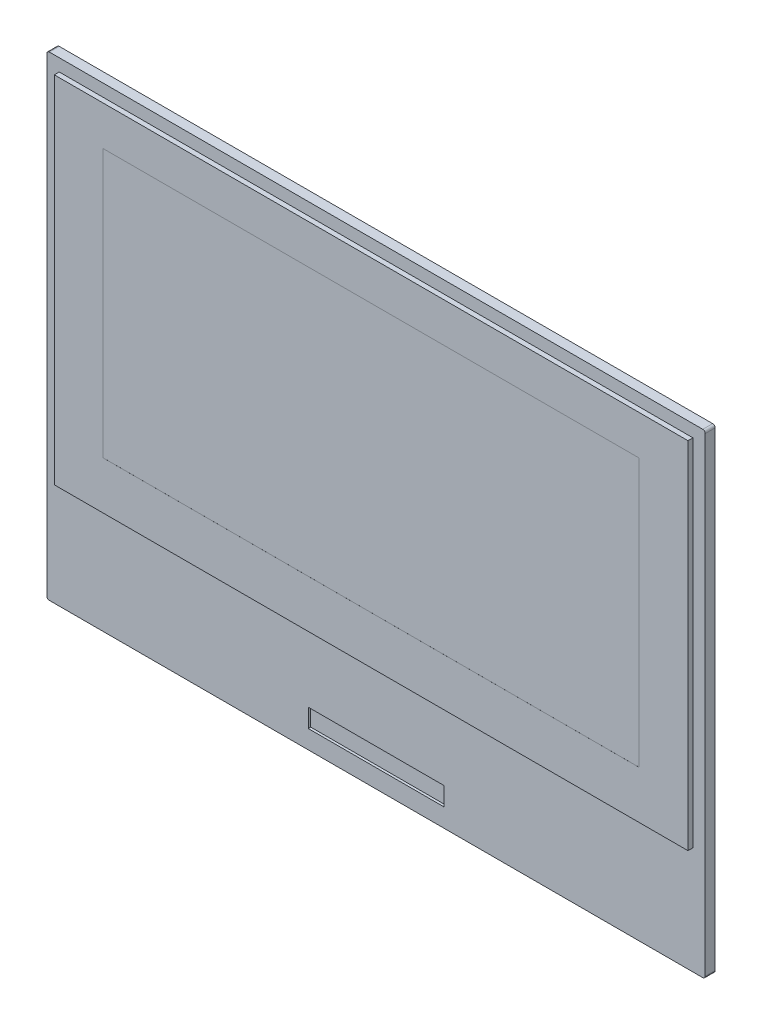
ISO-10303-21;
HEADER;
FILE_DESCRIPTION(('STEP AP214'),'2;1');
FILE_NAME('part.step','',(''),(''),'','','');
FILE_SCHEMA(('AUTOMOTIVE_DESIGN { 1 0 10303 214 1 1 1 1 }'));
ENDSEC;
DATA;
#1=APPLICATION_CONTEXT('core data for automotive mechanical design processes');
#2=APPLICATION_PROTOCOL_DEFINITION('international standard','automotive_design',2000,#1);
#3=PRODUCT_CONTEXT('',#1,'mechanical');
#4=PRODUCT('Part','Part','',(#3));
#5=PRODUCT_RELATED_PRODUCT_CATEGORY('part','',(#4));
#6=PRODUCT_DEFINITION_FORMATION('','',#4);
#7=PRODUCT_DEFINITION_CONTEXT('part definition',#1,'design');
#8=PRODUCT_DEFINITION('design','',#6,#7);
#9=PRODUCT_DEFINITION_SHAPE('','',#8);
#10=(LENGTH_UNIT() NAMED_UNIT(*) SI_UNIT(.MILLI.,.METRE.));
#11=(NAMED_UNIT(*) PLANE_ANGLE_UNIT() SI_UNIT($,.RADIAN.));
#12=(NAMED_UNIT(*) SI_UNIT($,.STERADIAN.) SOLID_ANGLE_UNIT());
#13=UNCERTAINTY_MEASURE_WITH_UNIT(LENGTH_MEASURE(1.E-05),#10,'distance_accuracy_value','');
#14=(GEOMETRIC_REPRESENTATION_CONTEXT(3) GLOBAL_UNCERTAINTY_ASSIGNED_CONTEXT((#13)) GLOBAL_UNIT_ASSIGNED_CONTEXT((#10,
#11,#12)) REPRESENTATION_CONTEXT('',''));
#15=CARTESIAN_POINT('',(0.,0.,0.));
#16=DIRECTION('',(0.,0.,1.));
#17=DIRECTION('',(1.,0.,0.));
#18=AXIS2_PLACEMENT_3D('',#15,#16,#17);
#19=CARTESIAN_POINT('',(0.,0.,0.));
#20=DIRECTION('',(0.,0.,1.));
#21=DIRECTION('',(1.,0.,0.));
#22=AXIS2_PLACEMENT_3D('',#19,#20,#21);
#23=PLANE('',#22);
#24=DIRECTION('',(0.,1.,0.));
#25=VECTOR('',#24,1.);
#26=CARTESIAN_POINT('',(2.75000000000001,-8.13,0.));
#27=LINE('',#26,#25);
#28=CARTESIAN_POINT('',(2.75000000000001,-8.88,0.));
#29=VERTEX_POINT('',#28);
#30=CARTESIAN_POINT('',(2.75000000000001,-8.13,0.));
#31=VERTEX_POINT('',#30);
#32=EDGE_CURVE('E57',#29,#31,#27,.T.);
#33=ORIENTED_EDGE('',*,*,#32,.F.);
#34=DIRECTION('',(1.,0.,0.));
#35=VECTOR('',#34,1.);
#36=CARTESIAN_POINT('',(-2.74999999999999,-8.88,0.));
#37=LINE('',#36,#35);
#38=CARTESIAN_POINT('',(-2.74999999999999,-8.88,0.));
#39=VERTEX_POINT('',#38);
#40=EDGE_CURVE('E237',#39,#29,#37,.T.);
#41=ORIENTED_EDGE('',*,*,#40,.F.);
#42=DIRECTION('',(0.,-1.,0.));
#43=VECTOR('',#42,1.);
#44=CARTESIAN_POINT('',(-2.74999999999999,-8.13,0.));
#45=LINE('',#44,#43);
#46=CARTESIAN_POINT('',(-2.74999999999999,-8.13,0.));
#47=VERTEX_POINT('',#46);
#48=EDGE_CURVE('E251',#47,#39,#45,.T.);
#49=ORIENTED_EDGE('',*,*,#48,.F.);
#50=DIRECTION('',(-1.,0.,0.));
#51=VECTOR('',#50,1.);
#52=CARTESIAN_POINT('',(-2.74999999999999,-8.13,0.));
#53=LINE('',#52,#51);
#54=EDGE_CURVE('E248',#31,#47,#53,.T.);
#55=ORIENTED_EDGE('',*,*,#54,.F.);
#56=EDGE_LOOP('',(#33,#41,#49,#55));
#57=FACE_BOUND('',#56,.T.);
#58=DIRECTION('',(1.,0.,0.));
#59=VECTOR('',#58,1.);
#60=CARTESIAN_POINT('',(-13.35,-9.63,0.));
#61=LINE('',#60,#59);
#62=CARTESIAN_POINT('',(-13.25,-9.63,0.));
#63=VERTEX_POINT('',#62);
#64=CARTESIAN_POINT('',(13.25,-9.63,0.));
#65=VERTEX_POINT('',#64);
#66=EDGE_CURVE('E329',#63,#65,#61,.T.);
#67=ORIENTED_EDGE('',*,*,#66,.T.);
#68=CARTESIAN_POINT('',(13.25,-9.53,0.));
#69=DIRECTION('',(0.,0.,1.));
#70=DIRECTION('',(1.,0.,0.));
#71=AXIS2_PLACEMENT_3D('',#68,#69,#70);
#72=CIRCLE('',#71,0.1);
#73=CARTESIAN_POINT('',(13.35,-9.53,0.));
#74=VERTEX_POINT('',#73);
#75=EDGE_CURVE('E359',#65,#74,#72,.T.);
#76=ORIENTED_EDGE('',*,*,#75,.T.);
#77=DIRECTION('',(0.,1.,0.));
#78=VECTOR('',#77,1.);
#79=CARTESIAN_POINT('',(13.35,9.63,0.));
#80=LINE('',#79,#78);
#81=CARTESIAN_POINT('',(13.35,9.53,0.));
#82=VERTEX_POINT('',#81);
#83=EDGE_CURVE('E324',#74,#82,#80,.T.);
#84=ORIENTED_EDGE('',*,*,#83,.T.);
#85=CARTESIAN_POINT('',(13.25,9.53,0.));
#86=DIRECTION('',(0.,0.,1.));
#87=DIRECTION('',(1.,0.,0.));
#88=AXIS2_PLACEMENT_3D('',#85,#86,#87);
#89=CIRCLE('',#88,0.1);
#90=CARTESIAN_POINT('',(13.25,9.63,0.));
#91=VERTEX_POINT('',#90);
#92=EDGE_CURVE('E353',#82,#91,#89,.T.);
#93=ORIENTED_EDGE('',*,*,#92,.T.);
#94=DIRECTION('',(-1.,0.,0.));
#95=VECTOR('',#94,1.);
#96=CARTESIAN_POINT('',(-13.35,9.63,0.));
#97=LINE('',#96,#95);
#98=CARTESIAN_POINT('',(-13.25,9.63,0.));
#99=VERTEX_POINT('',#98);
#100=EDGE_CURVE('E341',#91,#99,#97,.T.);
#101=ORIENTED_EDGE('',*,*,#100,.T.);
#102=CARTESIAN_POINT('',(-13.25,9.53,0.));
#103=DIRECTION('',(0.,0.,1.));
#104=DIRECTION('',(1.,0.,0.));
#105=AXIS2_PLACEMENT_3D('',#102,#103,#104);
#106=CIRCLE('',#105,0.1);
#107=CARTESIAN_POINT('',(-13.35,9.53,0.));
#108=VERTEX_POINT('',#107);
#109=EDGE_CURVE('E355',#99,#108,#106,.T.);
#110=ORIENTED_EDGE('',*,*,#109,.T.);
#111=DIRECTION('',(0.,-1.,0.));
#112=VECTOR('',#111,1.);
#113=CARTESIAN_POINT('',(-13.35,9.63,0.));
#114=LINE('',#113,#112);
#115=CARTESIAN_POINT('',(-13.35,-9.53,0.));
#116=VERTEX_POINT('',#115);
#117=EDGE_CURVE('E344',#108,#116,#114,.T.);
#118=ORIENTED_EDGE('',*,*,#117,.T.);
#119=CARTESIAN_POINT('',(-13.25,-9.53,0.));
#120=DIRECTION('',(0.,0.,1.));
#121=DIRECTION('',(1.,0.,0.));
#122=AXIS2_PLACEMENT_3D('',#119,#120,#121);
#123=CIRCLE('',#122,0.1);
#124=EDGE_CURVE('E357',#116,#63,#123,.T.);
#125=ORIENTED_EDGE('',*,*,#124,.T.);
#126=EDGE_LOOP('',(#67,#76,#84,#93,#101,#110,#118,#125));
#127=FACE_BOUND('',#126,.T.);
#128=DIRECTION('',(1.,0.,0.));
#129=VECTOR('',#128,1.);
#130=CARTESIAN_POINT('',(-12.85,-5.27,0.));
#131=LINE('',#130,#129);
#132=CARTESIAN_POINT('',(-12.85,-5.27,0.));
#133=VERTEX_POINT('',#132);
#134=CARTESIAN_POINT('',(12.85,-5.27,0.));
#135=VERTEX_POINT('',#134);
#136=EDGE_CURVE('E309',#133,#135,#131,.T.);
#137=ORIENTED_EDGE('',*,*,#136,.F.);
#138=DIRECTION('',(0.,-1.,0.));
#139=VECTOR('',#138,1.);
#140=CARTESIAN_POINT('',(-12.85,9.13,0.));
#141=LINE('',#140,#139);
#142=CARTESIAN_POINT('',(-12.85,9.13,0.));
#143=VERTEX_POINT('',#142);
#144=EDGE_CURVE('E289',#143,#133,#141,.T.);
#145=ORIENTED_EDGE('',*,*,#144,.F.);
#146=DIRECTION('',(-1.,0.,0.));
#147=VECTOR('',#146,1.);
#148=CARTESIAN_POINT('',(-12.85,9.13,0.));
#149=LINE('',#148,#147);
#150=CARTESIAN_POINT('',(12.85,9.13,0.));
#151=VERTEX_POINT('',#150);
#152=EDGE_CURVE('E300',#151,#143,#149,.T.);
#153=ORIENTED_EDGE('',*,*,#152,.F.);
#154=DIRECTION('',(0.,1.,0.));
#155=VECTOR('',#154,1.);
#156=CARTESIAN_POINT('',(12.85,9.13,0.));
#157=LINE('',#156,#155);
#158=EDGE_CURVE('E311',#135,#151,#157,.T.);
#159=ORIENTED_EDGE('',*,*,#158,.F.);
#160=EDGE_LOOP('',(#137,#145,#153,#159));
#161=FACE_BOUND('',#160,.T.);
#162=ADVANCED_FACE('F34',(#57,#127,#161),#23,.T.);
#163=CARTESIAN_POINT('',(13.35,9.63,-0.4));
#164=DIRECTION('',(1.,0.,0.));
#165=DIRECTION('',(0.,1.,0.));
#166=AXIS2_PLACEMENT_3D('',#163,#164,#165);
#167=PLANE('',#166);
#168=ORIENTED_EDGE('',*,*,#83,.F.);
#169=DIRECTION('',(0.,0.,1.));
#170=VECTOR('',#169,1.);
#171=CARTESIAN_POINT('',(13.35,-9.53,-0.4));
#172=LINE('',#171,#170);
#173=CARTESIAN_POINT('',(13.35,-9.53,-0.4));
#174=VERTEX_POINT('',#173);
#175=EDGE_CURVE('E364',#74,#174,#172,.F.);
#176=ORIENTED_EDGE('',*,*,#175,.T.);
#177=DIRECTION('',(0.,1.,0.));
#178=VECTOR('',#177,1.);
#179=CARTESIAN_POINT('',(13.35,9.63,-0.4));
#180=LINE('',#179,#178);
#181=CARTESIAN_POINT('',(13.35,9.53,-0.4));
#182=VERTEX_POINT('',#181);
#183=EDGE_CURVE('E325',#174,#182,#180,.T.);
#184=ORIENTED_EDGE('',*,*,#183,.T.);
#185=DIRECTION('',(0.,0.,1.));
#186=VECTOR('',#185,1.);
#187=CARTESIAN_POINT('',(13.35,9.53,-0.4));
#188=LINE('',#187,#186);
#189=EDGE_CURVE('E361',#182,#82,#188,.T.);
#190=ORIENTED_EDGE('',*,*,#189,.T.);
#191=EDGE_LOOP('',(#168,#176,#184,#190));
#192=FACE_BOUND('',#191,.T.);
#193=ADVANCED_FACE('F394',(#192),#167,.T.);
#194=CARTESIAN_POINT('',(-13.35,-9.63,-0.4));
#195=DIRECTION('',(0.,-1.,0.));
#196=DIRECTION('',(0.,0.,-1.));
#197=AXIS2_PLACEMENT_3D('',#194,#195,#196);
#198=PLANE('',#197);
#199=DIRECTION('',(1.,0.,0.));
#200=VECTOR('',#199,1.);
#201=CARTESIAN_POINT('',(-13.35,-9.63,-0.4));
#202=LINE('',#201,#200);
#203=CARTESIAN_POINT('',(-13.25,-9.63,-0.4));
#204=VERTEX_POINT('',#203);
#205=CARTESIAN_POINT('',(13.25,-9.63,-0.4));
#206=VERTEX_POINT('',#205);
#207=EDGE_CURVE('E335',#204,#206,#202,.T.);
#208=ORIENTED_EDGE('',*,*,#207,.T.);
#209=DIRECTION('',(0.,0.,1.));
#210=VECTOR('',#209,1.);
#211=CARTESIAN_POINT('',(13.25,-9.63,-0.4));
#212=LINE('',#211,#210);
#213=EDGE_CURVE('E350',#206,#65,#212,.T.);
#214=ORIENTED_EDGE('',*,*,#213,.T.);
#215=ORIENTED_EDGE('',*,*,#66,.F.);
#216=DIRECTION('',(0.,0.,1.));
#217=VECTOR('',#216,1.);
#218=CARTESIAN_POINT('',(-13.25,-9.63,-0.4));
#219=LINE('',#218,#217);
#220=EDGE_CURVE('E338',#63,#204,#219,.F.);
#221=ORIENTED_EDGE('',*,*,#220,.T.);
#222=EDGE_LOOP('',(#208,#214,#215,#221));
#223=FACE_BOUND('',#222,.T.);
#224=ADVANCED_FACE('F404',(#223),#198,.T.);
#225=CARTESIAN_POINT('',(-13.35,9.63,-0.4));
#226=DIRECTION('',(-1.,0.,0.));
#227=DIRECTION('',(0.,-1.,0.));
#228=AXIS2_PLACEMENT_3D('',#225,#226,#227);
#229=PLANE('',#228);
#230=DIRECTION('',(0.,-1.,0.));
#231=VECTOR('',#230,1.);
#232=CARTESIAN_POINT('',(-13.35,9.63,-0.4));
#233=LINE('',#232,#231);
#234=CARTESIAN_POINT('',(-13.35,9.53,-0.4));
#235=VERTEX_POINT('',#234);
#236=CARTESIAN_POINT('',(-13.35,-9.53,-0.4));
#237=VERTEX_POINT('',#236);
#238=EDGE_CURVE('E332',#235,#237,#233,.T.);
#239=ORIENTED_EDGE('',*,*,#238,.T.);
#240=DIRECTION('',(0.,0.,1.));
#241=VECTOR('',#240,1.);
#242=CARTESIAN_POINT('',(-13.35,-9.53,-0.4));
#243=LINE('',#242,#241);
#244=EDGE_CURVE('E376',#237,#116,#243,.T.);
#245=ORIENTED_EDGE('',*,*,#244,.T.);
#246=ORIENTED_EDGE('',*,*,#117,.F.);
#247=DIRECTION('',(0.,0.,1.));
#248=VECTOR('',#247,1.);
#249=CARTESIAN_POINT('',(-13.35,9.53,-0.4));
#250=LINE('',#249,#248);
#251=EDGE_CURVE('E374',#108,#235,#250,.F.);
#252=ORIENTED_EDGE('',*,*,#251,.T.);
#253=EDGE_LOOP('',(#239,#245,#246,#252));
#254=FACE_BOUND('',#253,.T.);
#255=ADVANCED_FACE('F413',(#254),#229,.T.);
#256=CARTESIAN_POINT('',(-13.35,9.63,-0.4));
#257=DIRECTION('',(0.,1.,0.));
#258=DIRECTION('',(0.,0.,1.));
#259=AXIS2_PLACEMENT_3D('',#256,#257,#258);
#260=PLANE('',#259);
#261=DIRECTION('',(-1.,0.,0.));
#262=VECTOR('',#261,1.);
#263=CARTESIAN_POINT('',(-13.35,9.63,-0.4));
#264=LINE('',#263,#262);
#265=CARTESIAN_POINT('',(13.25,9.63,-0.4));
#266=VERTEX_POINT('',#265);
#267=CARTESIAN_POINT('',(-13.25,9.63,-0.4));
#268=VERTEX_POINT('',#267);
#269=EDGE_CURVE('E328',#266,#268,#264,.T.);
#270=ORIENTED_EDGE('',*,*,#269,.T.);
#271=DIRECTION('',(0.,0.,1.));
#272=VECTOR('',#271,1.);
#273=CARTESIAN_POINT('',(-13.25,9.63,-0.4));
#274=LINE('',#273,#272);
#275=EDGE_CURVE('E11',#268,#99,#274,.T.);
#276=ORIENTED_EDGE('',*,*,#275,.T.);
#277=ORIENTED_EDGE('',*,*,#100,.F.);
#278=DIRECTION('',(0.,0.,1.));
#279=VECTOR('',#278,1.);
#280=CARTESIAN_POINT('',(13.25,9.63,-0.4));
#281=LINE('',#280,#279);
#282=EDGE_CURVE('E42',#91,#266,#281,.F.);
#283=ORIENTED_EDGE('',*,*,#282,.T.);
#284=EDGE_LOOP('',(#270,#276,#277,#283));
#285=FACE_BOUND('',#284,.T.);
#286=ADVANCED_FACE('F382',(#285),#260,.T.);
#287=CARTESIAN_POINT('',(0.,0.,-0.4));
#288=DIRECTION('',(0.,0.,1.));
#289=DIRECTION('',(1.,0.,0.));
#290=AXIS2_PLACEMENT_3D('',#287,#288,#289);
#291=PLANE('',#290);
#292=DIRECTION('',(1.,0.,0.));
#293=VECTOR('',#292,1.);
#294=CARTESIAN_POINT('',(2.74999999999999,-8.13,-0.4));
#295=LINE('',#294,#293);
#296=CARTESIAN_POINT('',(-2.75000000000001,-8.13,-0.4));
#297=VERTEX_POINT('',#296);
#298=CARTESIAN_POINT('',(2.74999999999999,-8.13,-0.4));
#299=VERTEX_POINT('',#298);
#300=EDGE_CURVE('E224',#297,#299,#295,.T.);
#301=ORIENTED_EDGE('',*,*,#300,.F.);
#302=DIRECTION('',(0.,1.,0.));
#303=VECTOR('',#302,1.);
#304=CARTESIAN_POINT('',(-2.75000000000001,-8.13,-0.4));
#305=LINE('',#304,#303);
#306=CARTESIAN_POINT('',(-2.75000000000001,-8.88,-0.4));
#307=VERTEX_POINT('',#306);
#308=EDGE_CURVE('E49',#307,#297,#305,.T.);
#309=ORIENTED_EDGE('',*,*,#308,.F.);
#310=DIRECTION('',(-1.,0.,0.));
#311=VECTOR('',#310,1.);
#312=CARTESIAN_POINT('',(2.74999999999999,-8.88,-0.4));
#313=LINE('',#312,#311);
#314=CARTESIAN_POINT('',(2.74999999999999,-8.88,-0.4));
#315=VERTEX_POINT('',#314);
#316=EDGE_CURVE('E215',#315,#307,#313,.T.);
#317=ORIENTED_EDGE('',*,*,#316,.F.);
#318=DIRECTION('',(0.,-1.,0.));
#319=VECTOR('',#318,1.);
#320=CARTESIAN_POINT('',(2.74999999999999,-8.13,-0.4));
#321=LINE('',#320,#319);
#322=EDGE_CURVE('E218',#299,#315,#321,.T.);
#323=ORIENTED_EDGE('',*,*,#322,.F.);
#324=EDGE_LOOP('',(#301,#309,#317,#323));
#325=FACE_BOUND('',#324,.T.);
#326=ORIENTED_EDGE('',*,*,#183,.F.);
#327=CARTESIAN_POINT('',(13.25,-9.53,-0.4));
#328=DIRECTION('',(0.,0.,1.));
#329=DIRECTION('',(1.,0.,0.));
#330=AXIS2_PLACEMENT_3D('',#327,#328,#329);
#331=CIRCLE('',#330,0.1);
#332=EDGE_CURVE('E372',#174,#206,#331,.F.);
#333=ORIENTED_EDGE('',*,*,#332,.T.);
#334=ORIENTED_EDGE('',*,*,#207,.F.);
#335=CARTESIAN_POINT('',(-13.25,-9.53,-0.4));
#336=DIRECTION('',(0.,0.,1.));
#337=DIRECTION('',(1.,0.,0.));
#338=AXIS2_PLACEMENT_3D('',#335,#336,#337);
#339=CIRCLE('',#338,0.1);
#340=EDGE_CURVE('E370',#204,#237,#339,.F.);
#341=ORIENTED_EDGE('',*,*,#340,.T.);
#342=ORIENTED_EDGE('',*,*,#238,.F.);
#343=CARTESIAN_POINT('',(-13.25,9.53,-0.4));
#344=DIRECTION('',(0.,0.,1.));
#345=DIRECTION('',(1.,0.,0.));
#346=AXIS2_PLACEMENT_3D('',#343,#344,#345);
#347=CIRCLE('',#346,0.1);
#348=EDGE_CURVE('E368',#235,#268,#347,.F.);
#349=ORIENTED_EDGE('',*,*,#348,.T.);
#350=ORIENTED_EDGE('',*,*,#269,.F.);
#351=CARTESIAN_POINT('',(13.25,9.53,-0.4));
#352=DIRECTION('',(0.,0.,1.));
#353=DIRECTION('',(1.,0.,0.));
#354=AXIS2_PLACEMENT_3D('',#351,#352,#353);
#355=CIRCLE('',#354,0.1);
#356=EDGE_CURVE('E366',#266,#182,#355,.F.);
#357=ORIENTED_EDGE('',*,*,#356,.T.);
#358=EDGE_LOOP('',(#326,#333,#334,#341,#342,#349,#350,#357));
#359=FACE_BOUND('',#358,.T.);
#360=ADVANCED_FACE('F388',(#325,#359),#291,.F.);
#361=CARTESIAN_POINT('',(-12.85,9.13,0.2));
#362=DIRECTION('',(1.,0.,0.));
#363=DIRECTION('',(0.,1.,0.));
#364=AXIS2_PLACEMENT_3D('',#361,#362,#363);
#365=PLANE('',#364);
#366=ORIENTED_EDGE('',*,*,#144,.T.);
#367=DIRECTION('',(0.,0.,-1.));
#368=VECTOR('',#367,1.);
#369=CARTESIAN_POINT('',(-12.85,-5.27,0.2));
#370=LINE('',#369,#368);
#371=CARTESIAN_POINT('',(-12.85,-5.27,0.2));
#372=VERTEX_POINT('',#371);
#373=EDGE_CURVE('E322',#372,#133,#370,.T.);
#374=ORIENTED_EDGE('',*,*,#373,.F.);
#375=DIRECTION('',(0.,-1.,0.));
#376=VECTOR('',#375,1.);
#377=CARTESIAN_POINT('',(-12.85,9.13,0.2));
#378=LINE('',#377,#376);
#379=CARTESIAN_POINT('',(-12.85,9.13,0.2));
#380=VERTEX_POINT('',#379);
#381=EDGE_CURVE('E296',#380,#372,#378,.T.);
#382=ORIENTED_EDGE('',*,*,#381,.F.);
#383=DIRECTION('',(0.,0.,-1.));
#384=VECTOR('',#383,1.);
#385=CARTESIAN_POINT('',(-12.85,9.13,0.2));
#386=LINE('',#385,#384);
#387=EDGE_CURVE('E306',#380,#143,#386,.T.);
#388=ORIENTED_EDGE('',*,*,#387,.T.);
#389=EDGE_LOOP('',(#366,#374,#382,#388));
#390=FACE_BOUND('',#389,.T.);
#391=ADVANCED_FACE('F484',(#390),#365,.F.);
#392=CARTESIAN_POINT('',(-12.85,-5.27,0.2));
#393=DIRECTION('',(0.,1.,0.));
#394=DIRECTION('',(0.,0.,1.));
#395=AXIS2_PLACEMENT_3D('',#392,#393,#394);
#396=PLANE('',#395);
#397=ORIENTED_EDGE('',*,*,#136,.T.);
#398=DIRECTION('',(0.,0.,-1.));
#399=VECTOR('',#398,1.);
#400=CARTESIAN_POINT('',(12.85,-5.27,0.2));
#401=LINE('',#400,#399);
#402=CARTESIAN_POINT('',(12.85,-5.27,0.2));
#403=VERTEX_POINT('',#402);
#404=EDGE_CURVE('E319',#403,#135,#401,.T.);
#405=ORIENTED_EDGE('',*,*,#404,.F.);
#406=DIRECTION('',(1.,0.,0.));
#407=VECTOR('',#406,1.);
#408=CARTESIAN_POINT('',(-12.85,-5.27,0.2));
#409=LINE('',#408,#407);
#410=EDGE_CURVE('E299',#372,#403,#409,.T.);
#411=ORIENTED_EDGE('',*,*,#410,.F.);
#412=ORIENTED_EDGE('',*,*,#373,.T.);
#413=EDGE_LOOP('',(#397,#405,#411,#412));
#414=FACE_BOUND('',#413,.T.);
#415=ADVANCED_FACE('F481',(#414),#396,.F.);
#416=CARTESIAN_POINT('',(12.85,9.13,0.2));
#417=DIRECTION('',(-1.,0.,0.));
#418=DIRECTION('',(0.,-1.,0.));
#419=AXIS2_PLACEMENT_3D('',#416,#417,#418);
#420=PLANE('',#419);
#421=ORIENTED_EDGE('',*,*,#158,.T.);
#422=DIRECTION('',(0.,0.,-1.));
#423=VECTOR('',#422,1.);
#424=CARTESIAN_POINT('',(12.85,9.13,0.2));
#425=LINE('',#424,#423);
#426=CARTESIAN_POINT('',(12.85,9.13,0.2));
#427=VERTEX_POINT('',#426);
#428=EDGE_CURVE('E317',#427,#151,#425,.T.);
#429=ORIENTED_EDGE('',*,*,#428,.F.);
#430=DIRECTION('',(0.,1.,0.));
#431=VECTOR('',#430,1.);
#432=CARTESIAN_POINT('',(12.85,9.13,0.2));
#433=LINE('',#432,#431);
#434=EDGE_CURVE('E302',#403,#427,#433,.T.);
#435=ORIENTED_EDGE('',*,*,#434,.F.);
#436=ORIENTED_EDGE('',*,*,#404,.T.);
#437=EDGE_LOOP('',(#421,#429,#435,#436));
#438=FACE_BOUND('',#437,.T.);
#439=ADVANCED_FACE('F477',(#438),#420,.F.);
#440=CARTESIAN_POINT('',(-12.85,9.13,0.2));
#441=DIRECTION('',(0.,-1.,0.));
#442=DIRECTION('',(0.,0.,-1.));
#443=AXIS2_PLACEMENT_3D('',#440,#441,#442);
#444=PLANE('',#443);
#445=ORIENTED_EDGE('',*,*,#152,.T.);
#446=ORIENTED_EDGE('',*,*,#387,.F.);
#447=DIRECTION('',(-1.,0.,0.));
#448=VECTOR('',#447,1.);
#449=CARTESIAN_POINT('',(-12.85,9.13,0.2));
#450=LINE('',#449,#448);
#451=EDGE_CURVE('E304',#427,#380,#450,.T.);
#452=ORIENTED_EDGE('',*,*,#451,.F.);
#453=ORIENTED_EDGE('',*,*,#428,.T.);
#454=EDGE_LOOP('',(#445,#446,#452,#453));
#455=FACE_BOUND('',#454,.T.);
#456=ADVANCED_FACE('F473',(#455),#444,.F.);
#457=CARTESIAN_POINT('',(0.,0.,0.2));
#458=DIRECTION('',(0.,0.,1.));
#459=DIRECTION('',(1.,0.,0.));
#460=AXIS2_PLACEMENT_3D('',#457,#458,#459);
#461=PLANE('',#460);
#462=DIRECTION('',(0.,-1.,0.));
#463=VECTOR('',#462,1.);
#464=CARTESIAN_POINT('',(-10.872,7.53,0.2));
#465=LINE('',#464,#463);
#466=CARTESIAN_POINT('',(-10.872,7.53,0.2));
#467=VERTEX_POINT('',#466);
#468=CARTESIAN_POINT('',(-10.872,-3.334,0.2));
#469=VERTEX_POINT('',#468);
#470=EDGE_CURVE('E258',#467,#469,#465,.T.);
#471=ORIENTED_EDGE('',*,*,#470,.F.);
#472=DIRECTION('',(-1.,0.,0.));
#473=VECTOR('',#472,1.);
#474=CARTESIAN_POINT('',(-10.872,7.53,0.2));
#475=LINE('',#474,#473);
#476=CARTESIAN_POINT('',(10.872,7.53,0.2));
#477=VERTEX_POINT('',#476);
#478=EDGE_CURVE('E268',#477,#467,#475,.T.);
#479=ORIENTED_EDGE('',*,*,#478,.F.);
#480=DIRECTION('',(0.,1.,0.));
#481=VECTOR('',#480,1.);
#482=CARTESIAN_POINT('',(10.872,7.53,0.2));
#483=LINE('',#482,#481);
#484=CARTESIAN_POINT('',(10.872,-3.334,0.2));
#485=VERTEX_POINT('',#484);
#486=EDGE_CURVE('E282',#485,#477,#483,.T.);
#487=ORIENTED_EDGE('',*,*,#486,.F.);
#488=DIRECTION('',(1.,0.,0.));
#489=VECTOR('',#488,1.);
#490=CARTESIAN_POINT('',(-10.872,-3.334,0.2));
#491=LINE('',#490,#489);
#492=EDGE_CURVE('E279',#469,#485,#491,.T.);
#493=ORIENTED_EDGE('',*,*,#492,.F.);
#494=EDGE_LOOP('',(#471,#479,#487,#493));
#495=FACE_BOUND('',#494,.T.);
#496=ORIENTED_EDGE('',*,*,#381,.T.);
#497=ORIENTED_EDGE('',*,*,#410,.T.);
#498=ORIENTED_EDGE('',*,*,#434,.T.);
#499=ORIENTED_EDGE('',*,*,#451,.T.);
#500=EDGE_LOOP('',(#496,#497,#498,#499));
#501=FACE_BOUND('',#500,.T.);
#502=ADVANCED_FACE('F469',(#495,#501),#461,.T.);
#503=CARTESIAN_POINT('',(-10.872,7.53,0.199));
#504=DIRECTION('',(-1.,0.,0.));
#505=DIRECTION('',(0.,-1.,0.));
#506=AXIS2_PLACEMENT_3D('',#503,#504,#505);
#507=PLANE('',#506);
#508=ORIENTED_EDGE('',*,*,#470,.T.);
#509=DIRECTION('',(0.,0.,1.));
#510=VECTOR('',#509,1.);
#511=CARTESIAN_POINT('',(-10.872,-3.334,0.199));
#512=LINE('',#511,#510);
#513=CARTESIAN_POINT('',(-10.872,-3.334,0.199));
#514=VERTEX_POINT('',#513);
#515=EDGE_CURVE('E277',#514,#469,#512,.T.);
#516=ORIENTED_EDGE('',*,*,#515,.F.);
#517=DIRECTION('',(0.,-1.,0.));
#518=VECTOR('',#517,1.);
#519=CARTESIAN_POINT('',(-10.872,7.53,0.199));
#520=LINE('',#519,#518);
#521=CARTESIAN_POINT('',(-10.872,7.53,0.199));
#522=VERTEX_POINT('',#521);
#523=EDGE_CURVE('E264',#522,#514,#520,.T.);
#524=ORIENTED_EDGE('',*,*,#523,.F.);
#525=DIRECTION('',(0.,0.,1.));
#526=VECTOR('',#525,1.);
#527=CARTESIAN_POINT('',(-10.872,7.53,0.199));
#528=LINE('',#527,#526);
#529=EDGE_CURVE('E287',#522,#467,#528,.T.);
#530=ORIENTED_EDGE('',*,*,#529,.T.);
#531=EDGE_LOOP('',(#508,#516,#524,#530));
#532=FACE_BOUND('',#531,.T.);
#533=ADVANCED_FACE('F462',(#532),#507,.F.);
#534=CARTESIAN_POINT('',(-10.872,7.53,0.199));
#535=DIRECTION('',(0.,1.,0.));
#536=DIRECTION('',(0.,0.,1.));
#537=AXIS2_PLACEMENT_3D('',#534,#535,#536);
#538=PLANE('',#537);
#539=ORIENTED_EDGE('',*,*,#478,.T.);
#540=ORIENTED_EDGE('',*,*,#529,.F.);
#541=DIRECTION('',(-1.,0.,0.));
#542=VECTOR('',#541,1.);
#543=CARTESIAN_POINT('',(-10.872,7.53,0.199));
#544=LINE('',#543,#542);
#545=CARTESIAN_POINT('',(10.872,7.53,0.199));
#546=VERTEX_POINT('',#545);
#547=EDGE_CURVE('E274',#546,#522,#544,.T.);
#548=ORIENTED_EDGE('',*,*,#547,.F.);
#549=DIRECTION('',(0.,0.,1.));
#550=VECTOR('',#549,1.);
#551=CARTESIAN_POINT('',(10.872,7.53,0.199));
#552=LINE('',#551,#550);
#553=EDGE_CURVE('E290',#546,#477,#552,.T.);
#554=ORIENTED_EDGE('',*,*,#553,.T.);
#555=EDGE_LOOP('',(#539,#540,#548,#554));
#556=FACE_BOUND('',#555,.T.);
#557=ADVANCED_FACE('F459',(#556),#538,.F.);
#558=CARTESIAN_POINT('',(10.872,7.53,0.199));
#559=DIRECTION('',(1.,0.,0.));
#560=DIRECTION('',(0.,1.,0.));
#561=AXIS2_PLACEMENT_3D('',#558,#559,#560);
#562=PLANE('',#561);
#563=ORIENTED_EDGE('',*,*,#486,.T.);
#564=ORIENTED_EDGE('',*,*,#553,.F.);
#565=DIRECTION('',(0.,1.,0.));
#566=VECTOR('',#565,1.);
#567=CARTESIAN_POINT('',(10.872,7.53,0.199));
#568=LINE('',#567,#566);
#569=CARTESIAN_POINT('',(10.872,-3.334,0.199));
#570=VERTEX_POINT('',#569);
#571=EDGE_CURVE('E271',#570,#546,#568,.T.);
#572=ORIENTED_EDGE('',*,*,#571,.F.);
#573=DIRECTION('',(0.,0.,1.));
#574=VECTOR('',#573,1.);
#575=CARTESIAN_POINT('',(10.872,-3.334,0.199));
#576=LINE('',#575,#574);
#577=EDGE_CURVE('E292',#570,#485,#576,.T.);
#578=ORIENTED_EDGE('',*,*,#577,.T.);
#579=EDGE_LOOP('',(#563,#564,#572,#578));
#580=FACE_BOUND('',#579,.T.);
#581=ADVANCED_FACE('F453',(#580),#562,.F.);
#582=CARTESIAN_POINT('',(-10.872,-3.334,0.199));
#583=DIRECTION('',(0.,-1.,0.));
#584=DIRECTION('',(0.,0.,-1.));
#585=AXIS2_PLACEMENT_3D('',#582,#583,#584);
#586=PLANE('',#585);
#587=ORIENTED_EDGE('',*,*,#492,.T.);
#588=ORIENTED_EDGE('',*,*,#577,.F.);
#589=DIRECTION('',(1.,0.,0.));
#590=VECTOR('',#589,1.);
#591=CARTESIAN_POINT('',(-10.872,-3.334,0.199));
#592=LINE('',#591,#590);
#593=EDGE_CURVE('E267',#514,#570,#592,.T.);
#594=ORIENTED_EDGE('',*,*,#593,.F.);
#595=ORIENTED_EDGE('',*,*,#515,.T.);
#596=EDGE_LOOP('',(#587,#588,#594,#595));
#597=FACE_BOUND('',#596,.T.);
#598=ADVANCED_FACE('F447',(#597),#586,.F.);
#599=CARTESIAN_POINT('',(0.,0.,0.199));
#600=DIRECTION('',(0.,0.,1.));
#601=DIRECTION('',(1.,0.,0.));
#602=AXIS2_PLACEMENT_3D('',#599,#600,#601);
#603=PLANE('',#602);
#604=ORIENTED_EDGE('',*,*,#523,.T.);
#605=ORIENTED_EDGE('',*,*,#593,.T.);
#606=ORIENTED_EDGE('',*,*,#571,.T.);
#607=ORIENTED_EDGE('',*,*,#547,.T.);
#608=EDGE_LOOP('',(#604,#605,#606,#607));
#609=FACE_BOUND('',#608,.T.);
#610=ADVANCED_FACE('F443',(#609),#603,.T.);
#611=CARTESIAN_POINT('',(13.25,-9.53,-0.4));
#612=DIRECTION('',(0.,0.,1.));
#613=DIRECTION('',(1.,0.,0.));
#614=AXIS2_PLACEMENT_3D('',#611,#612,#613);
#615=CYLINDRICAL_SURFACE('',#614,0.1);
#616=ORIENTED_EDGE('',*,*,#332,.F.);
#617=ORIENTED_EDGE('',*,*,#175,.F.);
#618=ORIENTED_EDGE('',*,*,#75,.F.);
#619=ORIENTED_EDGE('',*,*,#213,.F.);
#620=EDGE_LOOP('',(#616,#617,#618,#619));
#621=FACE_BOUND('',#620,.T.);
#622=ADVANCED_FACE('F402',(#621),#615,.T.);
#623=CARTESIAN_POINT('',(-13.25,-9.53,-0.4));
#624=DIRECTION('',(0.,0.,1.));
#625=DIRECTION('',(1.,0.,0.));
#626=AXIS2_PLACEMENT_3D('',#623,#624,#625);
#627=CYLINDRICAL_SURFACE('',#626,0.1);
#628=ORIENTED_EDGE('',*,*,#340,.F.);
#629=ORIENTED_EDGE('',*,*,#220,.F.);
#630=ORIENTED_EDGE('',*,*,#124,.F.);
#631=ORIENTED_EDGE('',*,*,#244,.F.);
#632=EDGE_LOOP('',(#628,#629,#630,#631));
#633=FACE_BOUND('',#632,.T.);
#634=ADVANCED_FACE('F410',(#633),#627,.T.);
#635=CARTESIAN_POINT('',(-13.25,9.53,-0.4));
#636=DIRECTION('',(0.,0.,1.));
#637=DIRECTION('',(1.,0.,0.));
#638=AXIS2_PLACEMENT_3D('',#635,#636,#637);
#639=CYLINDRICAL_SURFACE('',#638,0.1);
#640=ORIENTED_EDGE('',*,*,#348,.F.);
#641=ORIENTED_EDGE('',*,*,#251,.F.);
#642=ORIENTED_EDGE('',*,*,#109,.F.);
#643=ORIENTED_EDGE('',*,*,#275,.F.);
#644=EDGE_LOOP('',(#640,#641,#642,#643));
#645=FACE_BOUND('',#644,.T.);
#646=ADVANCED_FACE('F416',(#645),#639,.T.);
#647=CARTESIAN_POINT('',(13.25,9.53,-0.4));
#648=DIRECTION('',(0.,0.,1.));
#649=DIRECTION('',(1.,0.,0.));
#650=AXIS2_PLACEMENT_3D('',#647,#648,#649);
#651=CYLINDRICAL_SURFACE('',#650,0.1);
#652=ORIENTED_EDGE('',*,*,#356,.F.);
#653=ORIENTED_EDGE('',*,*,#282,.F.);
#654=ORIENTED_EDGE('',*,*,#92,.F.);
#655=ORIENTED_EDGE('',*,*,#189,.F.);
#656=EDGE_LOOP('',(#652,#653,#654,#655));
#657=FACE_BOUND('',#656,.T.);
#658=ADVANCED_FACE('F36',(#657),#651,.T.);
#659=CARTESIAN_POINT('',(2.75000000000001,-8.13,-0.1));
#660=DIRECTION('',(1.,0.,0.));
#661=DIRECTION('',(0.,0.,-1.));
#662=AXIS2_PLACEMENT_3D('',#659,#660,#661);
#663=PLANE('',#662);
#664=ORIENTED_EDGE('',*,*,#32,.T.);
#665=DIRECTION('',(0.,0.,1.));
#666=VECTOR('',#665,1.);
#667=CARTESIAN_POINT('',(2.75000000000001,-8.13,-0.1));
#668=LINE('',#667,#666);
#669=CARTESIAN_POINT('',(2.75000000000001,-8.13,-0.1));
#670=VERTEX_POINT('',#669);
#671=EDGE_CURVE('E246',#670,#31,#668,.T.);
#672=ORIENTED_EDGE('',*,*,#671,.F.);
#673=DIRECTION('',(0.,1.,0.));
#674=VECTOR('',#673,1.);
#675=CARTESIAN_POINT('',(2.75000000000001,-8.13,-0.1));
#676=LINE('',#675,#674);
#677=CARTESIAN_POINT('',(2.75000000000001,-8.88,-0.1));
#678=VERTEX_POINT('',#677);
#679=EDGE_CURVE('E233',#678,#670,#676,.T.);
#680=ORIENTED_EDGE('',*,*,#679,.F.);
#681=DIRECTION('',(0.,0.,1.));
#682=VECTOR('',#681,1.);
#683=CARTESIAN_POINT('',(2.75000000000001,-8.88,-0.1));
#684=LINE('',#683,#682);
#685=EDGE_CURVE('E256',#678,#29,#684,.T.);
#686=ORIENTED_EDGE('',*,*,#685,.T.);
#687=EDGE_LOOP('',(#664,#672,#680,#686));
#688=FACE_BOUND('',#687,.T.);
#689=ADVANCED_FACE('F422',(#688),#663,.F.);
#690=CARTESIAN_POINT('',(-2.74999999999999,-8.88,-0.1));
#691=DIRECTION('',(0.,-1.,0.));
#692=DIRECTION('',(0.,0.,-1.));
#693=AXIS2_PLACEMENT_3D('',#690,#691,#692);
#694=PLANE('',#693);
#695=ORIENTED_EDGE('',*,*,#40,.T.);
#696=ORIENTED_EDGE('',*,*,#685,.F.);
#697=DIRECTION('',(1.,0.,0.));
#698=VECTOR('',#697,1.);
#699=CARTESIAN_POINT('',(-2.74999999999999,-8.88,-0.1));
#700=LINE('',#699,#698);
#701=CARTESIAN_POINT('',(-2.74999999999999,-8.88,-0.1));
#702=VERTEX_POINT('',#701);
#703=EDGE_CURVE('E243',#702,#678,#700,.T.);
#704=ORIENTED_EDGE('',*,*,#703,.F.);
#705=DIRECTION('',(0.,0.,1.));
#706=VECTOR('',#705,1.);
#707=CARTESIAN_POINT('',(-2.74999999999999,-8.88,-0.1));
#708=LINE('',#707,#706);
#709=EDGE_CURVE('E259',#702,#39,#708,.T.);
#710=ORIENTED_EDGE('',*,*,#709,.T.);
#711=EDGE_LOOP('',(#695,#696,#704,#710));
#712=FACE_BOUND('',#711,.T.);
#713=ADVANCED_FACE('F531',(#712),#694,.F.);
#714=CARTESIAN_POINT('',(-2.74999999999999,-8.13,-0.1));
#715=DIRECTION('',(-1.,0.,0.));
#716=DIRECTION('',(0.,0.,1.));
#717=AXIS2_PLACEMENT_3D('',#714,#715,#716);
#718=PLANE('',#717);
#719=ORIENTED_EDGE('',*,*,#48,.T.);
#720=ORIENTED_EDGE('',*,*,#709,.F.);
#721=DIRECTION('',(0.,-1.,0.));
#722=VECTOR('',#721,1.);
#723=CARTESIAN_POINT('',(-2.74999999999999,-8.13,-0.1));
#724=LINE('',#723,#722);
#725=CARTESIAN_POINT('',(-2.74999999999999,-8.13,-0.1));
#726=VERTEX_POINT('',#725);
#727=EDGE_CURVE('E240',#726,#702,#724,.T.);
#728=ORIENTED_EDGE('',*,*,#727,.F.);
#729=DIRECTION('',(0.,0.,1.));
#730=VECTOR('',#729,1.);
#731=CARTESIAN_POINT('',(-2.74999999999999,-8.13,-0.1));
#732=LINE('',#731,#730);
#733=EDGE_CURVE('E261',#726,#47,#732,.T.);
#734=ORIENTED_EDGE('',*,*,#733,.T.);
#735=EDGE_LOOP('',(#719,#720,#728,#734));
#736=FACE_BOUND('',#735,.T.);
#737=ADVANCED_FACE('F534',(#736),#718,.F.);
#738=CARTESIAN_POINT('',(-2.74999999999999,-8.13,-0.1));
#739=DIRECTION('',(0.,1.,0.));
#740=DIRECTION('',(0.,0.,1.));
#741=AXIS2_PLACEMENT_3D('',#738,#739,#740);
#742=PLANE('',#741);
#743=ORIENTED_EDGE('',*,*,#54,.T.);
#744=ORIENTED_EDGE('',*,*,#733,.F.);
#745=DIRECTION('',(-1.,0.,0.));
#746=VECTOR('',#745,1.);
#747=CARTESIAN_POINT('',(-2.74999999999999,-8.13,-0.1));
#748=LINE('',#747,#746);
#749=EDGE_CURVE('E236',#670,#726,#748,.T.);
#750=ORIENTED_EDGE('',*,*,#749,.F.);
#751=ORIENTED_EDGE('',*,*,#671,.T.);
#752=EDGE_LOOP('',(#743,#744,#750,#751));
#753=FACE_BOUND('',#752,.T.);
#754=ADVANCED_FACE('F529',(#753),#742,.F.);
#755=CARTESIAN_POINT('',(0.,0.,-0.1));
#756=DIRECTION('',(0.,0.,1.));
#757=DIRECTION('',(1.,0.,0.));
#758=AXIS2_PLACEMENT_3D('',#755,#756,#757);
#759=PLANE('',#758);
#760=ORIENTED_EDGE('',*,*,#679,.T.);
#761=ORIENTED_EDGE('',*,*,#749,.T.);
#762=ORIENTED_EDGE('',*,*,#727,.T.);
#763=ORIENTED_EDGE('',*,*,#703,.T.);
#764=EDGE_LOOP('',(#760,#761,#762,#763));
#765=FACE_BOUND('',#764,.T.);
#766=ADVANCED_FACE('F521',(#765),#759,.T.);
#767=CARTESIAN_POINT('',(-2.75000000000001,-8.13,-0.3));
#768=DIRECTION('',(-1.,0.,0.));
#769=DIRECTION('',(0.,0.,1.));
#770=AXIS2_PLACEMENT_3D('',#767,#768,#769);
#771=PLANE('',#770);
#772=ORIENTED_EDGE('',*,*,#308,.T.);
#773=DIRECTION('',(0.,0.,-1.));
#774=VECTOR('',#773,1.);
#775=CARTESIAN_POINT('',(-2.75000000000001,-8.13,-0.3));
#776=LINE('',#775,#774);
#777=CARTESIAN_POINT('',(-2.75000000000001,-8.13,-0.3));
#778=VERTEX_POINT('',#777);
#779=EDGE_CURVE('E193',#778,#297,#776,.T.);
#780=ORIENTED_EDGE('',*,*,#779,.F.);
#781=DIRECTION('',(0.,1.,0.));
#782=VECTOR('',#781,1.);
#783=CARTESIAN_POINT('',(-2.75000000000001,-8.13,-0.3));
#784=LINE('',#783,#782);
#785=CARTESIAN_POINT('',(-2.75000000000001,-8.88,-0.3));
#786=VERTEX_POINT('',#785);
#787=EDGE_CURVE('E197',#786,#778,#784,.T.);
#788=ORIENTED_EDGE('',*,*,#787,.F.);
#789=DIRECTION('',(0.,0.,-1.));
#790=VECTOR('',#789,1.);
#791=CARTESIAN_POINT('',(-2.75000000000001,-8.88,-0.3));
#792=LINE('',#791,#790);
#793=EDGE_CURVE('E228',#786,#307,#792,.T.);
#794=ORIENTED_EDGE('',*,*,#793,.T.);
#795=EDGE_LOOP('',(#772,#780,#788,#794));
#796=FACE_BOUND('',#795,.T.);
#797=ADVANCED_FACE('F195',(#796),#771,.F.);
#798=CARTESIAN_POINT('',(2.74999999999999,-8.88,-0.3));
#799=DIRECTION('',(0.,-1.,0.));
#800=DIRECTION('',(0.,0.,-1.));
#801=AXIS2_PLACEMENT_3D('',#798,#799,#800);
#802=PLANE('',#801);
#803=ORIENTED_EDGE('',*,*,#316,.T.);
#804=ORIENTED_EDGE('',*,*,#793,.F.);
#805=DIRECTION('',(-1.,0.,0.));
#806=VECTOR('',#805,1.);
#807=CARTESIAN_POINT('',(2.74999999999999,-8.88,-0.3));
#808=LINE('',#807,#806);
#809=CARTESIAN_POINT('',(2.74999999999999,-8.88,-0.3));
#810=VERTEX_POINT('',#809);
#811=EDGE_CURVE('E203',#810,#786,#808,.T.);
#812=ORIENTED_EDGE('',*,*,#811,.F.);
#813=DIRECTION('',(0.,0.,-1.));
#814=VECTOR('',#813,1.);
#815=CARTESIAN_POINT('',(2.74999999999999,-8.88,-0.3));
#816=LINE('',#815,#814);
#817=EDGE_CURVE('E230',#810,#315,#816,.T.);
#818=ORIENTED_EDGE('',*,*,#817,.T.);
#819=EDGE_LOOP('',(#803,#804,#812,#818));
#820=FACE_BOUND('',#819,.T.);
#821=ADVANCED_FACE('F513',(#820),#802,.F.);
#822=CARTESIAN_POINT('',(2.74999999999999,-8.13,-0.3));
#823=DIRECTION('',(1.,0.,0.));
#824=DIRECTION('',(0.,0.,-1.));
#825=AXIS2_PLACEMENT_3D('',#822,#823,#824);
#826=PLANE('',#825);
#827=ORIENTED_EDGE('',*,*,#322,.T.);
#828=ORIENTED_EDGE('',*,*,#817,.F.);
#829=DIRECTION('',(0.,-1.,0.));
#830=VECTOR('',#829,1.);
#831=CARTESIAN_POINT('',(2.74999999999999,-8.13,-0.3));
#832=LINE('',#831,#830);
#833=CARTESIAN_POINT('',(2.74999999999999,-8.13,-0.3));
#834=VERTEX_POINT('',#833);
#835=EDGE_CURVE('E211',#834,#810,#832,.T.);
#836=ORIENTED_EDGE('',*,*,#835,.F.);
#837=DIRECTION('',(0.,0.,-1.));
#838=VECTOR('',#837,1.);
#839=CARTESIAN_POINT('',(2.74999999999999,-8.13,-0.3));
#840=LINE('',#839,#838);
#841=EDGE_CURVE('E202',#834,#299,#840,.T.);
#842=ORIENTED_EDGE('',*,*,#841,.T.);
#843=EDGE_LOOP('',(#827,#828,#836,#842));
#844=FACE_BOUND('',#843,.T.);
#845=ADVANCED_FACE('F511',(#844),#826,.F.);
#846=CARTESIAN_POINT('',(2.74999999999999,-8.13,-0.3));
#847=DIRECTION('',(0.,1.,0.));
#848=DIRECTION('',(0.,0.,1.));
#849=AXIS2_PLACEMENT_3D('',#846,#847,#848);
#850=PLANE('',#849);
#851=ORIENTED_EDGE('',*,*,#300,.T.);
#852=ORIENTED_EDGE('',*,*,#841,.F.);
#853=DIRECTION('',(1.,0.,0.));
#854=VECTOR('',#853,1.);
#855=CARTESIAN_POINT('',(2.74999999999999,-8.13,-0.3));
#856=LINE('',#855,#854);
#857=EDGE_CURVE('E206',#778,#834,#856,.T.);
#858=ORIENTED_EDGE('',*,*,#857,.F.);
#859=ORIENTED_EDGE('',*,*,#779,.T.);
#860=EDGE_LOOP('',(#851,#852,#858,#859));
#861=FACE_BOUND('',#860,.T.);
#862=ADVANCED_FACE('F207',(#861),#850,.F.);
#863=CARTESIAN_POINT('',(0.,0.,-0.3));
#864=DIRECTION('',(0.,0.,-1.));
#865=DIRECTION('',(-1.,0.,0.));
#866=AXIS2_PLACEMENT_3D('',#863,#864,#865);
#867=PLANE('',#866);
#868=ORIENTED_EDGE('',*,*,#787,.T.);
#869=ORIENTED_EDGE('',*,*,#857,.T.);
#870=ORIENTED_EDGE('',*,*,#835,.T.);
#871=ORIENTED_EDGE('',*,*,#811,.T.);
#872=EDGE_LOOP('',(#868,#869,#870,#871));
#873=FACE_BOUND('',#872,.T.);
#874=ADVANCED_FACE('F213',(#873),#867,.T.);
#875=CLOSED_SHELL('',(#162,#193,#224,#255,#286,#360,#391,#415,#439,#456,#502,#533,#557,#581,
#598,#610,#622,#634,#646,#658,#689,#713,#737,#754,#766,#797,#821,#845,#862,#874));
#876=MANIFOLD_SOLID_BREP('B2',#875);
#877=ADVANCED_BREP_SHAPE_REPRESENTATION('',(#18,#876),#14);
#878=SHAPE_DEFINITION_REPRESENTATION(#9,#877);
ENDSEC;
END-ISO-10303-21;
